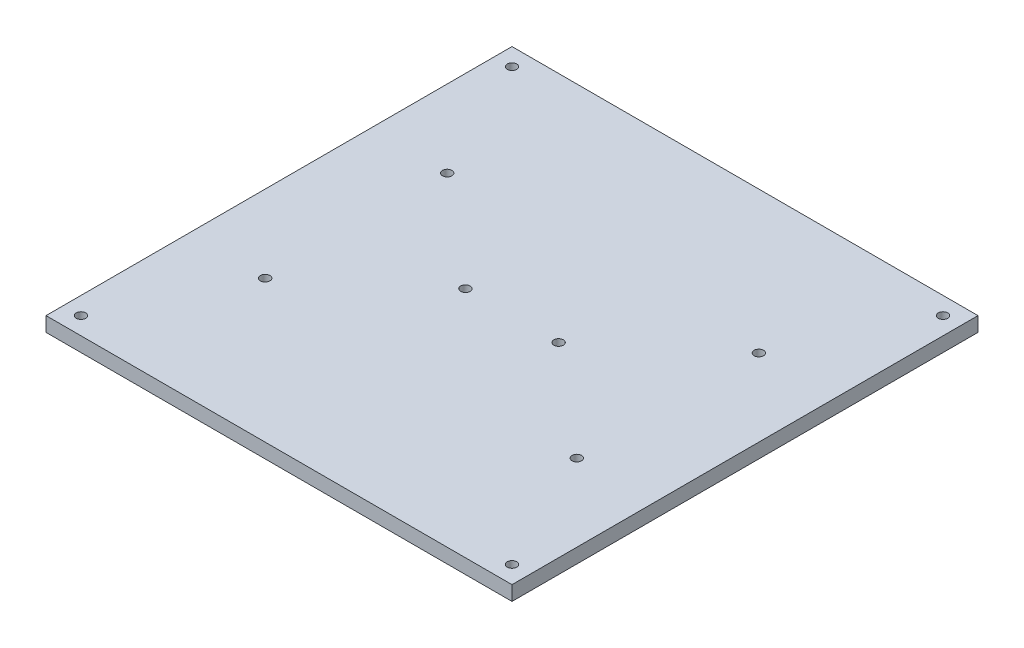
ISO-10303-21;
HEADER;
FILE_DESCRIPTION(('STEP AP214'),'2;1');
FILE_NAME('part.step','',(''),(''),'','','');
FILE_SCHEMA(('AUTOMOTIVE_DESIGN { 1 0 10303 214 1 1 1 1 }'));
ENDSEC;
DATA;
#1=APPLICATION_CONTEXT('core data for automotive mechanical design processes');
#2=APPLICATION_PROTOCOL_DEFINITION('international standard','automotive_design',2000,#1);
#3=PRODUCT_CONTEXT('',#1,'mechanical');
#4=PRODUCT('Part','Part','',(#3));
#5=PRODUCT_RELATED_PRODUCT_CATEGORY('part','',(#4));
#6=PRODUCT_DEFINITION_FORMATION('','',#4);
#7=PRODUCT_DEFINITION_CONTEXT('part definition',#1,'design');
#8=PRODUCT_DEFINITION('design','',#6,#7);
#9=PRODUCT_DEFINITION_SHAPE('','',#8);
#10=(LENGTH_UNIT() NAMED_UNIT(*) SI_UNIT(.MILLI.,.METRE.));
#11=(NAMED_UNIT(*) PLANE_ANGLE_UNIT() SI_UNIT($,.RADIAN.));
#12=(NAMED_UNIT(*) SI_UNIT($,.STERADIAN.) SOLID_ANGLE_UNIT());
#13=UNCERTAINTY_MEASURE_WITH_UNIT(LENGTH_MEASURE(1.E-05),#10,'distance_accuracy_value','');
#14=(GEOMETRIC_REPRESENTATION_CONTEXT(3) GLOBAL_UNCERTAINTY_ASSIGNED_CONTEXT((#13)) GLOBAL_UNIT_ASSIGNED_CONTEXT((#10,
#11,#12)) REPRESENTATION_CONTEXT('',''));
#15=CARTESIAN_POINT('',(0.,0.,0.));
#16=DIRECTION('',(0.,0.,1.));
#17=DIRECTION('',(1.,0.,0.));
#18=AXIS2_PLACEMENT_3D('',#15,#16,#17);
#19=CARTESIAN_POINT('',(-192.6,50.,80.));
#20=DIRECTION('',(1.,0.,0.));
#21=DIRECTION('',(0.,0.,-1.));
#22=AXIS2_PLACEMENT_3D('',#19,#20,#21);
#23=PLANE('',#22);
#24=DIRECTION('',(0.,1.,0.));
#25=VECTOR('',#24,1.);
#26=CARTESIAN_POINT('',(-192.6,52.5,80.));
#27=LINE('',#26,#25);
#28=CARTESIAN_POINT('',(-192.6,50.,80.));
#29=VERTEX_POINT('',#28);
#30=CARTESIAN_POINT('',(-192.6,55.,80.));
#31=VERTEX_POINT('',#30);
#32=EDGE_CURVE('E66',#29,#31,#27,.T.);
#33=ORIENTED_EDGE('',*,*,#32,.T.);
#34=DIRECTION('',(0.,0.,-1.));
#35=VECTOR('',#34,1.);
#36=CARTESIAN_POINT('',(-192.6,55.,0.));
#37=LINE('',#36,#35);
#38=CARTESIAN_POINT('',(-192.6,55.,-80.));
#39=VERTEX_POINT('',#38);
#40=EDGE_CURVE('E141',#31,#39,#37,.T.);
#41=ORIENTED_EDGE('',*,*,#40,.T.);
#42=DIRECTION('',(0.,-1.,0.));
#43=VECTOR('',#42,1.);
#44=CARTESIAN_POINT('',(-192.6,52.5,-80.));
#45=LINE('',#44,#43);
#46=CARTESIAN_POINT('',(-192.6,50.,-80.));
#47=VERTEX_POINT('',#46);
#48=EDGE_CURVE('E56',#39,#47,#45,.T.);
#49=ORIENTED_EDGE('',*,*,#48,.T.);
#50=DIRECTION('',(0.,0.,-1.));
#51=VECTOR('',#50,1.);
#52=CARTESIAN_POINT('',(-192.6,50.,0.));
#53=LINE('',#52,#51);
#54=EDGE_CURVE('E118',#29,#47,#53,.T.);
#55=ORIENTED_EDGE('',*,*,#54,.F.);
#56=EDGE_LOOP('',(#33,#41,#49,#55));
#57=FACE_BOUND('',#56,.T.);
#58=ADVANCED_FACE('F16',(#57),#23,.F.);
#59=CARTESIAN_POINT('',(-192.6,50.,-80.));
#60=DIRECTION('',(0.,0.,1.));
#61=DIRECTION('',(1.,0.,0.));
#62=AXIS2_PLACEMENT_3D('',#59,#60,#61);
#63=PLANE('',#62);
#64=ORIENTED_EDGE('',*,*,#48,.F.);
#65=DIRECTION('',(1.,0.,0.));
#66=VECTOR('',#65,1.);
#67=CARTESIAN_POINT('',(-112.6,55.,-80.));
#68=LINE('',#67,#66);
#69=CARTESIAN_POINT('',(-32.6,55.,-80.));
#70=VERTEX_POINT('',#69);
#71=EDGE_CURVE('E72',#39,#70,#68,.T.);
#72=ORIENTED_EDGE('',*,*,#71,.T.);
#73=DIRECTION('',(0.,-1.,0.));
#74=VECTOR('',#73,1.);
#75=CARTESIAN_POINT('',(-32.6,52.5,-80.));
#76=LINE('',#75,#74);
#77=CARTESIAN_POINT('',(-32.6,50.,-80.));
#78=VERTEX_POINT('',#77);
#79=EDGE_CURVE('E62',#70,#78,#76,.T.);
#80=ORIENTED_EDGE('',*,*,#79,.T.);
#81=DIRECTION('',(1.,0.,0.));
#82=VECTOR('',#81,1.);
#83=CARTESIAN_POINT('',(-112.6,50.,-80.));
#84=LINE('',#83,#82);
#85=EDGE_CURVE('E148',#47,#78,#84,.T.);
#86=ORIENTED_EDGE('',*,*,#85,.F.);
#87=EDGE_LOOP('',(#64,#72,#80,#86));
#88=FACE_BOUND('',#87,.T.);
#89=ADVANCED_FACE('F77',(#88),#63,.F.);
#90=CARTESIAN_POINT('',(-32.6,50.,-80.));
#91=DIRECTION('',(-1.,0.,0.));
#92=DIRECTION('',(0.,0.,1.));
#93=AXIS2_PLACEMENT_3D('',#90,#91,#92);
#94=PLANE('',#93);
#95=ORIENTED_EDGE('',*,*,#79,.F.);
#96=DIRECTION('',(0.,0.,1.));
#97=VECTOR('',#96,1.);
#98=CARTESIAN_POINT('',(-32.6,55.,0.));
#99=LINE('',#98,#97);
#100=CARTESIAN_POINT('',(-32.6,55.,80.));
#101=VERTEX_POINT('',#100);
#102=EDGE_CURVE('E65',#70,#101,#99,.T.);
#103=ORIENTED_EDGE('',*,*,#102,.T.);
#104=DIRECTION('',(0.,-1.,0.));
#105=VECTOR('',#104,1.);
#106=CARTESIAN_POINT('',(-32.6,52.5,80.));
#107=LINE('',#106,#105);
#108=CARTESIAN_POINT('',(-32.6,50.,80.));
#109=VERTEX_POINT('',#108);
#110=EDGE_CURVE('E78',#101,#109,#107,.T.);
#111=ORIENTED_EDGE('',*,*,#110,.T.);
#112=DIRECTION('',(0.,0.,1.));
#113=VECTOR('',#112,1.);
#114=CARTESIAN_POINT('',(-32.6,50.,0.));
#115=LINE('',#114,#113);
#116=EDGE_CURVE('E35',#78,#109,#115,.T.);
#117=ORIENTED_EDGE('',*,*,#116,.F.);
#118=EDGE_LOOP('',(#95,#103,#111,#117));
#119=FACE_BOUND('',#118,.T.);
#120=ADVANCED_FACE('F64',(#119),#94,.F.);
#121=CARTESIAN_POINT('',(-32.6,50.,80.));
#122=DIRECTION('',(0.,0.,-1.));
#123=DIRECTION('',(-1.,0.,0.));
#124=AXIS2_PLACEMENT_3D('',#121,#122,#123);
#125=PLANE('',#124);
#126=ORIENTED_EDGE('',*,*,#110,.F.);
#127=DIRECTION('',(-1.,0.,0.));
#128=VECTOR('',#127,1.);
#129=CARTESIAN_POINT('',(-112.6,55.,80.));
#130=LINE('',#129,#128);
#131=EDGE_CURVE('E75',#101,#31,#130,.T.);
#132=ORIENTED_EDGE('',*,*,#131,.T.);
#133=ORIENTED_EDGE('',*,*,#32,.F.);
#134=DIRECTION('',(-1.,0.,0.));
#135=VECTOR('',#134,1.);
#136=CARTESIAN_POINT('',(-112.6,50.,80.));
#137=LINE('',#136,#135);
#138=EDGE_CURVE('E114',#109,#29,#137,.T.);
#139=ORIENTED_EDGE('',*,*,#138,.F.);
#140=EDGE_LOOP('',(#126,#132,#133,#139));
#141=FACE_BOUND('',#140,.T.);
#142=ADVANCED_FACE('F154',(#141),#125,.F.);
#143=CARTESIAN_POINT('',(-166.1,55.,31.25));
#144=DIRECTION('',(0.,-1.,0.));
#145=DIRECTION('',(0.,0.,-1.));
#146=AXIS2_PLACEMENT_3D('',#143,#144,#145);
#147=CYLINDRICAL_SURFACE('',#146,1.625);
#148=CARTESIAN_POINT('',(-166.1,50.,31.25));
#149=DIRECTION('',(0.,-1.,0.));
#150=DIRECTION('',(0.,0.,-1.));
#151=AXIS2_PLACEMENT_3D('',#148,#149,#150);
#152=CIRCLE('',#151,1.625);
#153=CARTESIAN_POINT('',(-166.1,50.,29.625));
#154=VERTEX_POINT('',#153);
#155=EDGE_CURVE('E111',#154,#154,#152,.F.);
#156=ORIENTED_EDGE('',*,*,#155,.F.);
#157=EDGE_LOOP('',(#156));
#158=FACE_BOUND('',#157,.T.);
#159=CARTESIAN_POINT('',(-166.1,55.,31.25));
#160=DIRECTION('',(0.,-1.,0.));
#161=DIRECTION('',(0.,0.,-1.));
#162=AXIS2_PLACEMENT_3D('',#159,#160,#161);
#163=CIRCLE('',#162,1.625);
#164=CARTESIAN_POINT('',(-166.1,55.,29.625));
#165=VERTEX_POINT('',#164);
#166=EDGE_CURVE('E20',#165,#165,#163,.F.);
#167=ORIENTED_EDGE('',*,*,#166,.T.);
#168=EDGE_LOOP('',(#167));
#169=FACE_BOUND('',#168,.T.);
#170=ADVANCED_FACE('F156',(#158,#169),#147,.F.);
#171=CARTESIAN_POINT('',(-186.6,55.,-74.));
#172=DIRECTION('',(0.,-1.,0.));
#173=DIRECTION('',(0.,0.,-1.));
#174=AXIS2_PLACEMENT_3D('',#171,#172,#173);
#175=CYLINDRICAL_SURFACE('',#174,1.62499999999999);
#176=CARTESIAN_POINT('',(-186.6,50.,-74.));
#177=DIRECTION('',(0.,-1.,0.));
#178=DIRECTION('',(0.,0.,-1.));
#179=AXIS2_PLACEMENT_3D('',#176,#177,#178);
#180=CIRCLE('',#179,1.62499999999999);
#181=CARTESIAN_POINT('',(-186.6,50.,-75.625));
#182=VERTEX_POINT('',#181);
#183=EDGE_CURVE('E108',#182,#182,#180,.F.);
#184=ORIENTED_EDGE('',*,*,#183,.F.);
#185=EDGE_LOOP('',(#184));
#186=FACE_BOUND('',#185,.T.);
#187=CARTESIAN_POINT('',(-186.6,55.,-74.));
#188=DIRECTION('',(0.,-1.,0.));
#189=DIRECTION('',(0.,0.,-1.));
#190=AXIS2_PLACEMENT_3D('',#187,#188,#189);
#191=CIRCLE('',#190,1.62499999999999);
#192=CARTESIAN_POINT('',(-186.6,55.,-75.625));
#193=VERTEX_POINT('',#192);
#194=EDGE_CURVE('E136',#193,#193,#191,.F.);
#195=ORIENTED_EDGE('',*,*,#194,.T.);
#196=EDGE_LOOP('',(#195));
#197=FACE_BOUND('',#196,.T.);
#198=ADVANCED_FACE('F163',(#186,#197),#175,.F.);
#199=CARTESIAN_POINT('',(-166.1,55.,-31.25));
#200=DIRECTION('',(0.,-1.,0.));
#201=DIRECTION('',(0.,0.,-1.));
#202=AXIS2_PLACEMENT_3D('',#199,#200,#201);
#203=CYLINDRICAL_SURFACE('',#202,1.625);
#204=CARTESIAN_POINT('',(-166.1,50.,-31.25));
#205=DIRECTION('',(0.,-1.,0.));
#206=DIRECTION('',(0.,0.,-1.));
#207=AXIS2_PLACEMENT_3D('',#204,#205,#206);
#208=CIRCLE('',#207,1.625);
#209=CARTESIAN_POINT('',(-166.1,50.,-32.875));
#210=VERTEX_POINT('',#209);
#211=EDGE_CURVE('E105',#210,#210,#208,.F.);
#212=ORIENTED_EDGE('',*,*,#211,.F.);
#213=EDGE_LOOP('',(#212));
#214=FACE_BOUND('',#213,.T.);
#215=CARTESIAN_POINT('',(-166.1,55.,-31.25));
#216=DIRECTION('',(0.,-1.,0.));
#217=DIRECTION('',(0.,0.,-1.));
#218=AXIS2_PLACEMENT_3D('',#215,#216,#217);
#219=CIRCLE('',#218,1.625);
#220=CARTESIAN_POINT('',(-166.1,55.,-32.875));
#221=VERTEX_POINT('',#220);
#222=EDGE_CURVE('E134',#221,#221,#219,.F.);
#223=ORIENTED_EDGE('',*,*,#222,.T.);
#224=EDGE_LOOP('',(#223));
#225=FACE_BOUND('',#224,.T.);
#226=ADVANCED_FACE('F200',(#214,#225),#203,.F.);
#227=CARTESIAN_POINT('',(-38.6,55.,-74.));
#228=DIRECTION('',(0.,-1.,0.));
#229=DIRECTION('',(0.,0.,-1.));
#230=AXIS2_PLACEMENT_3D('',#227,#228,#229);
#231=CYLINDRICAL_SURFACE('',#230,1.62499999999999);
#232=CARTESIAN_POINT('',(-38.6,50.,-74.));
#233=DIRECTION('',(0.,-1.,0.));
#234=DIRECTION('',(0.,0.,-1.));
#235=AXIS2_PLACEMENT_3D('',#232,#233,#234);
#236=CIRCLE('',#235,1.62499999999999);
#237=CARTESIAN_POINT('',(-38.6,50.,-75.625));
#238=VERTEX_POINT('',#237);
#239=EDGE_CURVE('E102',#238,#238,#236,.F.);
#240=ORIENTED_EDGE('',*,*,#239,.F.);
#241=EDGE_LOOP('',(#240));
#242=FACE_BOUND('',#241,.T.);
#243=CARTESIAN_POINT('',(-38.6,55.,-74.));
#244=DIRECTION('',(0.,-1.,0.));
#245=DIRECTION('',(0.,0.,-1.));
#246=AXIS2_PLACEMENT_3D('',#243,#244,#245);
#247=CIRCLE('',#246,1.62499999999999);
#248=CARTESIAN_POINT('',(-38.6,55.,-75.625));
#249=VERTEX_POINT('',#248);
#250=EDGE_CURVE('E131',#249,#249,#247,.F.);
#251=ORIENTED_EDGE('',*,*,#250,.T.);
#252=EDGE_LOOP('',(#251));
#253=FACE_BOUND('',#252,.T.);
#254=ADVANCED_FACE('F196',(#242,#253),#231,.F.);
#255=CARTESIAN_POINT('',(-96.6,55.,0.));
#256=DIRECTION('',(0.,-1.,0.));
#257=DIRECTION('',(0.,0.,-1.));
#258=AXIS2_PLACEMENT_3D('',#255,#256,#257);
#259=CYLINDRICAL_SURFACE('',#258,1.625);
#260=CARTESIAN_POINT('',(-96.6,50.,0.));
#261=DIRECTION('',(0.,-1.,0.));
#262=DIRECTION('',(0.,0.,-1.));
#263=AXIS2_PLACEMENT_3D('',#260,#261,#262);
#264=CIRCLE('',#263,1.625);
#265=CARTESIAN_POINT('',(-96.6,50.,-1.625));
#266=VERTEX_POINT('',#265);
#267=EDGE_CURVE('E99',#266,#266,#264,.F.);
#268=ORIENTED_EDGE('',*,*,#267,.F.);
#269=EDGE_LOOP('',(#268));
#270=FACE_BOUND('',#269,.T.);
#271=CARTESIAN_POINT('',(-96.6,55.,0.));
#272=DIRECTION('',(0.,-1.,0.));
#273=DIRECTION('',(0.,0.,-1.));
#274=AXIS2_PLACEMENT_3D('',#271,#272,#273);
#275=CIRCLE('',#274,1.625);
#276=CARTESIAN_POINT('',(-96.6,55.,-1.625));
#277=VERTEX_POINT('',#276);
#278=EDGE_CURVE('E128',#277,#277,#275,.F.);
#279=ORIENTED_EDGE('',*,*,#278,.T.);
#280=EDGE_LOOP('',(#279));
#281=FACE_BOUND('',#280,.T.);
#282=ADVANCED_FACE('F192',(#270,#281),#259,.F.);
#283=CARTESIAN_POINT('',(-128.6,55.,0.));
#284=DIRECTION('',(0.,-1.,0.));
#285=DIRECTION('',(0.,0.,-1.));
#286=AXIS2_PLACEMENT_3D('',#283,#284,#285);
#287=CYLINDRICAL_SURFACE('',#286,1.625);
#288=CARTESIAN_POINT('',(-128.6,50.,0.));
#289=DIRECTION('',(0.,-1.,0.));
#290=DIRECTION('',(0.,0.,-1.));
#291=AXIS2_PLACEMENT_3D('',#288,#289,#290);
#292=CIRCLE('',#291,1.625);
#293=CARTESIAN_POINT('',(-128.6,50.,-1.625));
#294=VERTEX_POINT('',#293);
#295=EDGE_CURVE('E96',#294,#294,#292,.F.);
#296=ORIENTED_EDGE('',*,*,#295,.F.);
#297=EDGE_LOOP('',(#296));
#298=FACE_BOUND('',#297,.T.);
#299=CARTESIAN_POINT('',(-128.6,55.,0.));
#300=DIRECTION('',(0.,-1.,0.));
#301=DIRECTION('',(0.,0.,-1.));
#302=AXIS2_PLACEMENT_3D('',#299,#300,#301);
#303=CIRCLE('',#302,1.625);
#304=CARTESIAN_POINT('',(-128.6,55.,-1.625));
#305=VERTEX_POINT('',#304);
#306=EDGE_CURVE('E125',#305,#305,#303,.F.);
#307=ORIENTED_EDGE('',*,*,#306,.T.);
#308=EDGE_LOOP('',(#307));
#309=FACE_BOUND('',#308,.T.);
#310=ADVANCED_FACE('F188',(#298,#309),#287,.F.);
#311=CARTESIAN_POINT('',(-38.6,55.,74.));
#312=DIRECTION('',(0.,-1.,0.));
#313=DIRECTION('',(0.,0.,-1.));
#314=AXIS2_PLACEMENT_3D('',#311,#312,#313);
#315=CYLINDRICAL_SURFACE('',#314,1.62500000000002);
#316=CARTESIAN_POINT('',(-38.6,50.,74.));
#317=DIRECTION('',(0.,-1.,0.));
#318=DIRECTION('',(0.,0.,-1.));
#319=AXIS2_PLACEMENT_3D('',#316,#317,#318);
#320=CIRCLE('',#319,1.62500000000002);
#321=CARTESIAN_POINT('',(-38.6,50.,72.375));
#322=VERTEX_POINT('',#321);
#323=EDGE_CURVE('E93',#322,#322,#320,.F.);
#324=ORIENTED_EDGE('',*,*,#323,.F.);
#325=EDGE_LOOP('',(#324));
#326=FACE_BOUND('',#325,.T.);
#327=CARTESIAN_POINT('',(-38.6,55.,74.));
#328=DIRECTION('',(0.,-1.,0.));
#329=DIRECTION('',(0.,0.,-1.));
#330=AXIS2_PLACEMENT_3D('',#327,#328,#329);
#331=CIRCLE('',#330,1.62500000000002);
#332=CARTESIAN_POINT('',(-38.6,55.,72.375));
#333=VERTEX_POINT('',#332);
#334=EDGE_CURVE('E122',#333,#333,#331,.F.);
#335=ORIENTED_EDGE('',*,*,#334,.T.);
#336=EDGE_LOOP('',(#335));
#337=FACE_BOUND('',#336,.T.);
#338=ADVANCED_FACE('F184',(#326,#337),#315,.F.);
#339=CARTESIAN_POINT('',(-59.1,55.,-31.25));
#340=DIRECTION('',(0.,-1.,0.));
#341=DIRECTION('',(0.,0.,-1.));
#342=AXIS2_PLACEMENT_3D('',#339,#340,#341);
#343=CYLINDRICAL_SURFACE('',#342,1.625);
#344=CARTESIAN_POINT('',(-59.1,50.,-31.25));
#345=DIRECTION('',(0.,-1.,0.));
#346=DIRECTION('',(0.,0.,-1.));
#347=AXIS2_PLACEMENT_3D('',#344,#345,#346);
#348=CIRCLE('',#347,1.625);
#349=CARTESIAN_POINT('',(-59.1,50.,-32.875));
#350=VERTEX_POINT('',#349);
#351=EDGE_CURVE('E90',#350,#350,#348,.F.);
#352=ORIENTED_EDGE('',*,*,#351,.F.);
#353=EDGE_LOOP('',(#352));
#354=FACE_BOUND('',#353,.T.);
#355=CARTESIAN_POINT('',(-59.1,55.,-31.25));
#356=DIRECTION('',(0.,-1.,0.));
#357=DIRECTION('',(0.,0.,-1.));
#358=AXIS2_PLACEMENT_3D('',#355,#356,#357);
#359=CIRCLE('',#358,1.625);
#360=CARTESIAN_POINT('',(-59.1,55.,-32.875));
#361=VERTEX_POINT('',#360);
#362=EDGE_CURVE('E119',#361,#361,#359,.F.);
#363=ORIENTED_EDGE('',*,*,#362,.T.);
#364=EDGE_LOOP('',(#363));
#365=FACE_BOUND('',#364,.T.);
#366=ADVANCED_FACE('F180',(#354,#365),#343,.F.);
#367=CARTESIAN_POINT('',(-59.1,55.,31.25));
#368=DIRECTION('',(0.,-1.,0.));
#369=DIRECTION('',(0.,0.,-1.));
#370=AXIS2_PLACEMENT_3D('',#367,#368,#369);
#371=CYLINDRICAL_SURFACE('',#370,1.625);
#372=CARTESIAN_POINT('',(-59.1,50.,31.25));
#373=DIRECTION('',(0.,-1.,0.));
#374=DIRECTION('',(0.,0.,-1.));
#375=AXIS2_PLACEMENT_3D('',#372,#373,#374);
#376=CIRCLE('',#375,1.625);
#377=CARTESIAN_POINT('',(-59.1,50.,29.625));
#378=VERTEX_POINT('',#377);
#379=EDGE_CURVE('E87',#378,#378,#376,.F.);
#380=ORIENTED_EDGE('',*,*,#379,.F.);
#381=EDGE_LOOP('',(#380));
#382=FACE_BOUND('',#381,.T.);
#383=CARTESIAN_POINT('',(-59.1,55.,31.25));
#384=DIRECTION('',(0.,-1.,0.));
#385=DIRECTION('',(0.,0.,-1.));
#386=AXIS2_PLACEMENT_3D('',#383,#384,#385);
#387=CIRCLE('',#386,1.625);
#388=CARTESIAN_POINT('',(-59.1,55.,29.625));
#389=VERTEX_POINT('',#388);
#390=EDGE_CURVE('E115',#389,#389,#387,.F.);
#391=ORIENTED_EDGE('',*,*,#390,.T.);
#392=EDGE_LOOP('',(#391));
#393=FACE_BOUND('',#392,.T.);
#394=ADVANCED_FACE('F177',(#382,#393),#371,.F.);
#395=CARTESIAN_POINT('',(-192.6,55.,80.));
#396=DIRECTION('',(0.,-1.,0.));
#397=DIRECTION('',(0.,0.,-1.));
#398=AXIS2_PLACEMENT_3D('',#395,#396,#397);
#399=PLANE('',#398);
#400=ORIENTED_EDGE('',*,*,#390,.F.);
#401=EDGE_LOOP('',(#400));
#402=FACE_BOUND('',#401,.T.);
#403=ORIENTED_EDGE('',*,*,#362,.F.);
#404=EDGE_LOOP('',(#403));
#405=FACE_BOUND('',#404,.T.);
#406=ORIENTED_EDGE('',*,*,#334,.F.);
#407=EDGE_LOOP('',(#406));
#408=FACE_BOUND('',#407,.T.);
#409=ORIENTED_EDGE('',*,*,#306,.F.);
#410=EDGE_LOOP('',(#409));
#411=FACE_BOUND('',#410,.T.);
#412=ORIENTED_EDGE('',*,*,#278,.F.);
#413=EDGE_LOOP('',(#412));
#414=FACE_BOUND('',#413,.T.);
#415=ORIENTED_EDGE('',*,*,#250,.F.);
#416=EDGE_LOOP('',(#415));
#417=FACE_BOUND('',#416,.T.);
#418=ORIENTED_EDGE('',*,*,#222,.F.);
#419=EDGE_LOOP('',(#418));
#420=FACE_BOUND('',#419,.T.);
#421=ORIENTED_EDGE('',*,*,#194,.F.);
#422=EDGE_LOOP('',(#421));
#423=FACE_BOUND('',#422,.T.);
#424=ORIENTED_EDGE('',*,*,#166,.F.);
#425=EDGE_LOOP('',(#424));
#426=FACE_BOUND('',#425,.T.);
#427=CARTESIAN_POINT('',(-186.6,55.,74.));
#428=DIRECTION('',(0.,-1.,0.));
#429=DIRECTION('',(0.,0.,-1.));
#430=AXIS2_PLACEMENT_3D('',#427,#428,#429);
#431=CIRCLE('',#430,1.62500000000002);
#432=CARTESIAN_POINT('',(-186.6,55.,72.375));
#433=VERTEX_POINT('',#432);
#434=EDGE_CURVE('E26',#433,#433,#431,.F.);
#435=ORIENTED_EDGE('',*,*,#434,.F.);
#436=EDGE_LOOP('',(#435));
#437=FACE_BOUND('',#436,.T.);
#438=ORIENTED_EDGE('',*,*,#131,.F.);
#439=ORIENTED_EDGE('',*,*,#102,.F.);
#440=ORIENTED_EDGE('',*,*,#71,.F.);
#441=ORIENTED_EDGE('',*,*,#40,.F.);
#442=EDGE_LOOP('',(#438,#439,#440,#441));
#443=FACE_BOUND('',#442,.T.);
#444=ADVANCED_FACE('F70',(#402,#405,#408,#411,#414,#417,#420,#423,#426,#437,#443),#399,.F.);
#445=CARTESIAN_POINT('',(-192.6,50.,80.));
#446=DIRECTION('',(0.,-1.,0.));
#447=DIRECTION('',(0.,0.,-1.));
#448=AXIS2_PLACEMENT_3D('',#445,#446,#447);
#449=PLANE('',#448);
#450=ORIENTED_EDGE('',*,*,#379,.T.);
#451=EDGE_LOOP('',(#450));
#452=FACE_BOUND('',#451,.T.);
#453=ORIENTED_EDGE('',*,*,#351,.T.);
#454=EDGE_LOOP('',(#453));
#455=FACE_BOUND('',#454,.T.);
#456=ORIENTED_EDGE('',*,*,#323,.T.);
#457=EDGE_LOOP('',(#456));
#458=FACE_BOUND('',#457,.T.);
#459=ORIENTED_EDGE('',*,*,#295,.T.);
#460=EDGE_LOOP('',(#459));
#461=FACE_BOUND('',#460,.T.);
#462=ORIENTED_EDGE('',*,*,#267,.T.);
#463=EDGE_LOOP('',(#462));
#464=FACE_BOUND('',#463,.T.);
#465=ORIENTED_EDGE('',*,*,#239,.T.);
#466=EDGE_LOOP('',(#465));
#467=FACE_BOUND('',#466,.T.);
#468=ORIENTED_EDGE('',*,*,#211,.T.);
#469=EDGE_LOOP('',(#468));
#470=FACE_BOUND('',#469,.T.);
#471=ORIENTED_EDGE('',*,*,#183,.T.);
#472=EDGE_LOOP('',(#471));
#473=FACE_BOUND('',#472,.T.);
#474=ORIENTED_EDGE('',*,*,#155,.T.);
#475=EDGE_LOOP('',(#474));
#476=FACE_BOUND('',#475,.T.);
#477=CARTESIAN_POINT('',(-186.6,50.,74.));
#478=DIRECTION('',(0.,-1.,0.));
#479=DIRECTION('',(0.,0.,-1.));
#480=AXIS2_PLACEMENT_3D('',#477,#478,#479);
#481=CIRCLE('',#480,1.62500000000002);
#482=CARTESIAN_POINT('',(-186.6,50.,72.375));
#483=VERTEX_POINT('',#482);
#484=EDGE_CURVE('E10',#483,#483,#481,.T.);
#485=ORIENTED_EDGE('',*,*,#484,.F.);
#486=EDGE_LOOP('',(#485));
#487=FACE_BOUND('',#486,.T.);
#488=ORIENTED_EDGE('',*,*,#116,.T.);
#489=ORIENTED_EDGE('',*,*,#138,.T.);
#490=ORIENTED_EDGE('',*,*,#54,.T.);
#491=ORIENTED_EDGE('',*,*,#85,.T.);
#492=EDGE_LOOP('',(#488,#489,#490,#491));
#493=FACE_BOUND('',#492,.T.);
#494=ADVANCED_FACE('F18',(#452,#455,#458,#461,#464,#467,#470,#473,#476,#487,#493),#449,.T.);
#495=CARTESIAN_POINT('',(-186.6,55.,74.));
#496=DIRECTION('',(0.,-1.,0.));
#497=DIRECTION('',(0.,0.,-1.));
#498=AXIS2_PLACEMENT_3D('',#495,#496,#497);
#499=CYLINDRICAL_SURFACE('',#498,1.62500000000002);
#500=ORIENTED_EDGE('',*,*,#484,.T.);
#501=EDGE_LOOP('',(#500));
#502=FACE_BOUND('',#501,.T.);
#503=ORIENTED_EDGE('',*,*,#434,.T.);
#504=EDGE_LOOP('',(#503));
#505=FACE_BOUND('',#504,.T.);
#506=ADVANCED_FACE('F167',(#502,#505),#499,.F.);
#507=CLOSED_SHELL('',(#58,#89,#120,#142,#170,#198,#226,#254,#282,#310,#338,#366,#394,#444,#494,#506));
#508=MANIFOLD_SOLID_BREP('B1',#507);
#509=ADVANCED_BREP_SHAPE_REPRESENTATION('',(#18,#508),#14);
#510=SHAPE_DEFINITION_REPRESENTATION(#9,#509);
ENDSEC;
END-ISO-10303-21;
